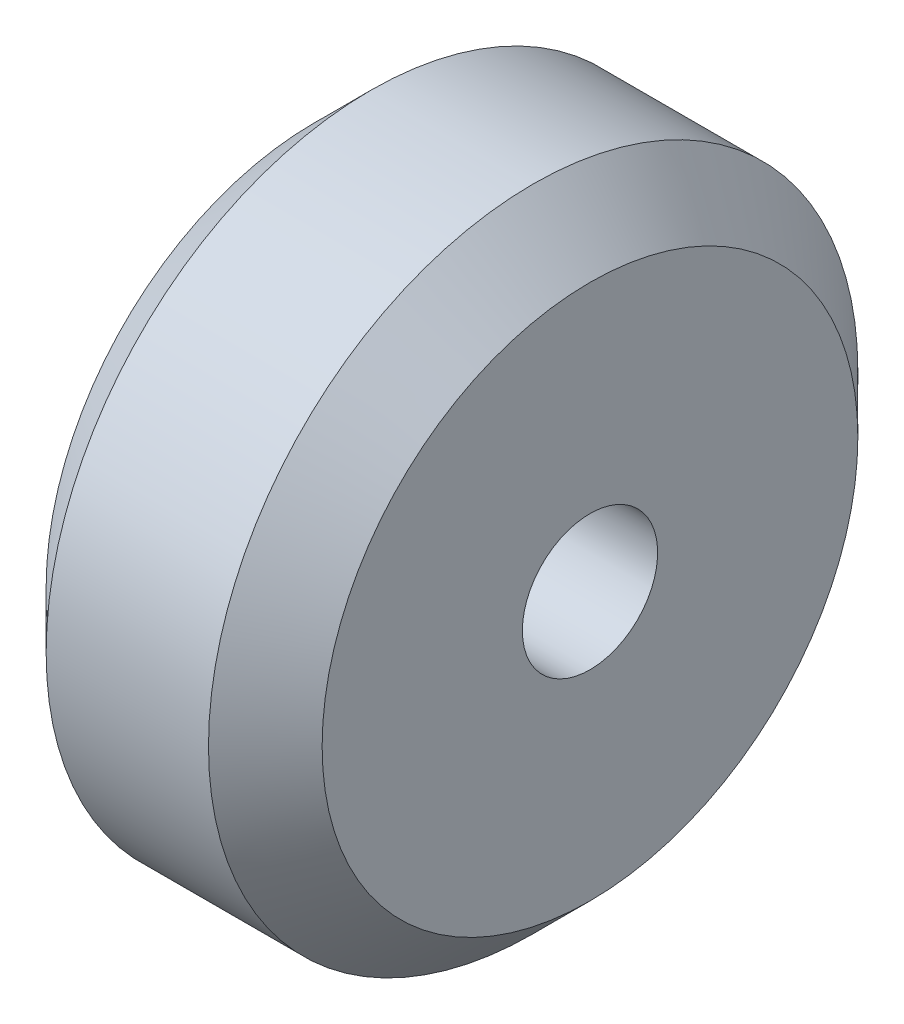
ISO-10303-21;
HEADER;
FILE_DESCRIPTION(('STEP AP214'),'2;1');
FILE_NAME('part.step','',(''),(''),'','','');
FILE_SCHEMA(('AUTOMOTIVE_DESIGN { 1 0 10303 214 1 1 1 1 }'));
ENDSEC;
DATA;
#1=APPLICATION_CONTEXT('core data for automotive mechanical design processes');
#2=APPLICATION_PROTOCOL_DEFINITION('international standard','automotive_design',2000,#1);
#3=PRODUCT_CONTEXT('',#1,'mechanical');
#4=PRODUCT('Part','Part','',(#3));
#5=PRODUCT_RELATED_PRODUCT_CATEGORY('part','',(#4));
#6=PRODUCT_DEFINITION_FORMATION('','',#4);
#7=PRODUCT_DEFINITION_CONTEXT('part definition',#1,'design');
#8=PRODUCT_DEFINITION('design','',#6,#7);
#9=PRODUCT_DEFINITION_SHAPE('','',#8);
#10=(LENGTH_UNIT() NAMED_UNIT(*) SI_UNIT(.MILLI.,.METRE.));
#11=(NAMED_UNIT(*) PLANE_ANGLE_UNIT() SI_UNIT($,.RADIAN.));
#12=(NAMED_UNIT(*) SI_UNIT($,.STERADIAN.) SOLID_ANGLE_UNIT());
#13=UNCERTAINTY_MEASURE_WITH_UNIT(LENGTH_MEASURE(1.E-05),#10,'distance_accuracy_value','');
#14=(GEOMETRIC_REPRESENTATION_CONTEXT(3) GLOBAL_UNCERTAINTY_ASSIGNED_CONTEXT((#13)) GLOBAL_UNIT_ASSIGNED_CONTEXT((#10,
#11,#12)) REPRESENTATION_CONTEXT('',''));
#15=CARTESIAN_POINT('',(0.,0.,0.));
#16=DIRECTION('',(0.,0.,1.));
#17=DIRECTION('',(1.,0.,0.));
#18=AXIS2_PLACEMENT_3D('',#15,#16,#17);
#19=CARTESIAN_POINT('',(10.2,0.,-9.9));
#20=DIRECTION('',(-1.,0.,0.));
#21=DIRECTION('',(0.,0.,1.));
#22=AXIS2_PLACEMENT_3D('',#19,#20,#21);
#23=PLANE('',#22);
#24=CARTESIAN_POINT('',(10.2,0.,0.));
#25=DIRECTION('',(-1.,0.,0.));
#26=DIRECTION('',(0.,0.,1.));
#27=AXIS2_PLACEMENT_3D('',#24,#25,#26);
#28=CIRCLE('',#27,9.9);
#29=CARTESIAN_POINT('',(10.2,0.,9.9));
#30=VERTEX_POINT('',#29);
#31=EDGE_CURVE('E56',#30,#30,#28,.T.);
#32=ORIENTED_EDGE('',*,*,#31,.F.);
#33=EDGE_LOOP('',(#32));
#34=FACE_BOUND('',#33,.T.);
#35=CARTESIAN_POINT('',(10.2,0.,0.));
#36=DIRECTION('',(-1.,0.,0.));
#37=DIRECTION('',(0.,0.,1.));
#38=AXIS2_PLACEMENT_3D('',#35,#36,#37);
#39=CIRCLE('',#38,2.5);
#40=CARTESIAN_POINT('',(10.2,0.,2.5));
#41=VERTEX_POINT('',#40);
#42=EDGE_CURVE('E10',#41,#41,#39,.T.);
#43=ORIENTED_EDGE('',*,*,#42,.T.);
#44=EDGE_LOOP('',(#43));
#45=FACE_BOUND('',#44,.T.);
#46=ADVANCED_FACE('F34',(#34,#45),#23,.F.);
#47=CARTESIAN_POINT('',(0.,0.,0.));
#48=DIRECTION('',(-1.,0.,0.));
#49=DIRECTION('',(0.,0.,1.));
#50=AXIS2_PLACEMENT_3D('',#47,#48,#49);
#51=CYLINDRICAL_SURFACE('',#50,2.5);
#52=ORIENTED_EDGE('',*,*,#42,.F.);
#53=EDGE_LOOP('',(#52));
#54=FACE_BOUND('',#53,.T.);
#55=CARTESIAN_POINT('',(0.,0.,0.));
#56=DIRECTION('',(-1.,0.,0.));
#57=DIRECTION('',(0.,0.,1.));
#58=AXIS2_PLACEMENT_3D('',#55,#56,#57);
#59=CIRCLE('',#58,2.5);
#60=CARTESIAN_POINT('',(0.,0.,2.5));
#61=VERTEX_POINT('',#60);
#62=EDGE_CURVE('E40',#61,#61,#59,.T.);
#63=ORIENTED_EDGE('',*,*,#62,.T.);
#64=EDGE_LOOP('',(#63));
#65=FACE_BOUND('',#64,.T.);
#66=ADVANCED_FACE('F63',(#54,#65),#51,.F.);
#67=CARTESIAN_POINT('',(0.,0.,-2.5));
#68=DIRECTION('',(1.,0.,0.));
#69=DIRECTION('',(0.,0.,-1.));
#70=AXIS2_PLACEMENT_3D('',#67,#68,#69);
#71=PLANE('',#70);
#72=ORIENTED_EDGE('',*,*,#62,.F.);
#73=EDGE_LOOP('',(#72));
#74=FACE_BOUND('',#73,.T.);
#75=CARTESIAN_POINT('',(0.,0.,0.));
#76=DIRECTION('',(-1.,0.,0.));
#77=DIRECTION('',(0.,0.,1.));
#78=AXIS2_PLACEMENT_3D('',#75,#76,#77);
#79=CIRCLE('',#78,9.9);
#80=CARTESIAN_POINT('',(0.,0.,9.9));
#81=VERTEX_POINT('',#80);
#82=EDGE_CURVE('E44',#81,#81,#79,.T.);
#83=ORIENTED_EDGE('',*,*,#82,.T.);
#84=EDGE_LOOP('',(#83));
#85=FACE_BOUND('',#84,.T.);
#86=ADVANCED_FACE('F67',(#74,#85),#71,.F.);
#87=CARTESIAN_POINT('',(2.1,0.,0.));
#88=DIRECTION('',(1.,0.,0.));
#89=DIRECTION('',(0.,0.,-1.));
#90=AXIS2_PLACEMENT_3D('',#87,#88,#89);
#91=CONICAL_SURFACE('',#90,12.,0.785398163397448);
#92=ORIENTED_EDGE('',*,*,#82,.F.);
#93=EDGE_LOOP('',(#92));
#94=FACE_BOUND('',#93,.T.);
#95=CARTESIAN_POINT('',(2.1,0.,0.));
#96=DIRECTION('',(-1.,0.,0.));
#97=DIRECTION('',(0.,0.,1.));
#98=AXIS2_PLACEMENT_3D('',#95,#96,#97);
#99=CIRCLE('',#98,12.);
#100=CARTESIAN_POINT('',(2.1,0.,12.));
#101=VERTEX_POINT('',#100);
#102=EDGE_CURVE('E48',#101,#101,#99,.T.);
#103=ORIENTED_EDGE('',*,*,#102,.T.);
#104=EDGE_LOOP('',(#103));
#105=FACE_BOUND('',#104,.T.);
#106=ADVANCED_FACE('F72',(#94,#105),#91,.T.);
#107=CARTESIAN_POINT('',(0.,0.,0.));
#108=DIRECTION('',(-1.,0.,0.));
#109=DIRECTION('',(0.,0.,1.));
#110=AXIS2_PLACEMENT_3D('',#107,#108,#109);
#111=CYLINDRICAL_SURFACE('',#110,12.);
#112=ORIENTED_EDGE('',*,*,#102,.F.);
#113=EDGE_LOOP('',(#112));
#114=FACE_BOUND('',#113,.T.);
#115=CARTESIAN_POINT('',(8.1,0.,0.));
#116=DIRECTION('',(-1.,0.,0.));
#117=DIRECTION('',(0.,0.,1.));
#118=AXIS2_PLACEMENT_3D('',#115,#116,#117);
#119=CIRCLE('',#118,12.);
#120=CARTESIAN_POINT('',(8.1,0.,12.));
#121=VERTEX_POINT('',#120);
#122=EDGE_CURVE('E53',#121,#121,#119,.T.);
#123=ORIENTED_EDGE('',*,*,#122,.T.);
#124=EDGE_LOOP('',(#123));
#125=FACE_BOUND('',#124,.T.);
#126=ADVANCED_FACE('F78',(#114,#125),#111,.T.);
#127=CARTESIAN_POINT('',(10.2,0.,0.));
#128=DIRECTION('',(-1.,0.,0.));
#129=DIRECTION('',(0.,0.,1.));
#130=AXIS2_PLACEMENT_3D('',#127,#128,#129);
#131=CONICAL_SURFACE('',#130,9.9,0.785398163397448);
#132=ORIENTED_EDGE('',*,*,#122,.F.);
#133=EDGE_LOOP('',(#132));
#134=FACE_BOUND('',#133,.T.);
#135=ORIENTED_EDGE('',*,*,#31,.T.);
#136=EDGE_LOOP('',(#135));
#137=FACE_BOUND('',#136,.T.);
#138=ADVANCED_FACE('F60',(#134,#137),#131,.T.);
#139=CLOSED_SHELL('',(#46,#66,#86,#106,#126,#138));
#140=MANIFOLD_SOLID_BREP('B2',#139);
#141=ADVANCED_BREP_SHAPE_REPRESENTATION('',(#18,#140),#14);
#142=SHAPE_DEFINITION_REPRESENTATION(#9,#141);
ENDSEC;
END-ISO-10303-21;
